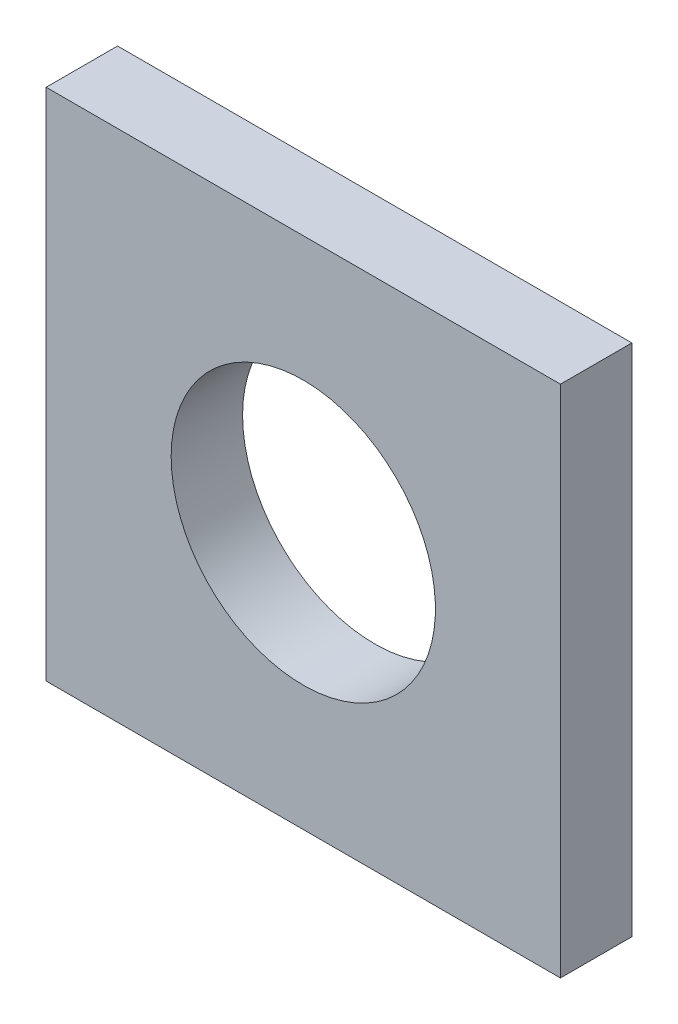
ISO-10303-21;
HEADER;
FILE_DESCRIPTION(('STEP AP214'),'2;1');
FILE_NAME('part.step','',(''),(''),'','','');
FILE_SCHEMA(('AUTOMOTIVE_DESIGN { 1 0 10303 214 1 1 1 1 }'));
ENDSEC;
DATA;
#1=APPLICATION_CONTEXT('core data for automotive mechanical design processes');
#2=APPLICATION_PROTOCOL_DEFINITION('international standard','automotive_design',2000,#1);
#3=PRODUCT_CONTEXT('',#1,'mechanical');
#4=PRODUCT('Part','Part','',(#3));
#5=PRODUCT_RELATED_PRODUCT_CATEGORY('part','',(#4));
#6=PRODUCT_DEFINITION_FORMATION('','',#4);
#7=PRODUCT_DEFINITION_CONTEXT('part definition',#1,'design');
#8=PRODUCT_DEFINITION('design','',#6,#7);
#9=PRODUCT_DEFINITION_SHAPE('','',#8);
#10=(LENGTH_UNIT() NAMED_UNIT(*) SI_UNIT(.MILLI.,.METRE.));
#11=(NAMED_UNIT(*) PLANE_ANGLE_UNIT() SI_UNIT($,.RADIAN.));
#12=(NAMED_UNIT(*) SI_UNIT($,.STERADIAN.) SOLID_ANGLE_UNIT());
#13=UNCERTAINTY_MEASURE_WITH_UNIT(LENGTH_MEASURE(1.E-05),#10,'distance_accuracy_value','');
#14=(GEOMETRIC_REPRESENTATION_CONTEXT(3) GLOBAL_UNCERTAINTY_ASSIGNED_CONTEXT((#13)) GLOBAL_UNIT_ASSIGNED_CONTEXT((#10,
#11,#12)) REPRESENTATION_CONTEXT('',''));
#15=CARTESIAN_POINT('',(0.,0.,0.));
#16=DIRECTION('',(0.,0.,1.));
#17=DIRECTION('',(1.,0.,0.));
#18=AXIS2_PLACEMENT_3D('',#15,#16,#17);
#19=CARTESIAN_POINT('',(0.,0.,0.));
#20=DIRECTION('',(0.,0.,1.));
#21=DIRECTION('',(1.,0.,0.));
#22=AXIS2_PLACEMENT_3D('',#19,#20,#21);
#23=PLANE('',#22);
#24=CARTESIAN_POINT('',(17.8459235605229,-15.7575757575758,0.));
#25=DIRECTION('',(0.,0.,-1.));
#26=DIRECTION('',(-1.,0.,0.));
#27=AXIS2_PLACEMENT_3D('',#24,#25,#26);
#28=CIRCLE('',#27,9.25);
#29=CARTESIAN_POINT('',(8.59592356052291,-15.7575757575758,0.));
#30=VERTEX_POINT('',#29);
#31=EDGE_CURVE('E96',#30,#30,#28,.T.);
#32=ORIENTED_EDGE('',*,*,#31,.F.);
#33=EDGE_LOOP('',(#32));
#34=FACE_BOUND('',#33,.T.);
#35=DIRECTION('',(0.,-1.,0.));
#36=VECTOR('',#35,1.);
#37=CARTESIAN_POINT('',(-0.154076439477094,2.24242424242424,0.));
#38=LINE('',#37,#36);
#39=CARTESIAN_POINT('',(-0.154076439477094,2.24242424242424,0.));
#40=VERTEX_POINT('',#39);
#41=CARTESIAN_POINT('',(-0.15407643947709,-33.7575757575758,0.));
#42=VERTEX_POINT('',#41);
#43=EDGE_CURVE('E79',#40,#42,#38,.T.);
#44=ORIENTED_EDGE('',*,*,#43,.F.);
#45=DIRECTION('',(-1.,0.,0.));
#46=VECTOR('',#45,1.);
#47=CARTESIAN_POINT('',(-0.154076439477094,2.24242424242424,0.));
#48=LINE('',#47,#46);
#49=CARTESIAN_POINT('',(35.8459235605229,2.24242424242424,0.));
#50=VERTEX_POINT('',#49);
#51=EDGE_CURVE('E48',#50,#40,#48,.T.);
#52=ORIENTED_EDGE('',*,*,#51,.F.);
#53=DIRECTION('',(0.,1.,0.));
#54=VECTOR('',#53,1.);
#55=CARTESIAN_POINT('',(35.8459235605229,2.24242424242424,0.));
#56=LINE('',#55,#54);
#57=CARTESIAN_POINT('',(35.8459235605229,-33.7575757575758,0.));
#58=VERTEX_POINT('',#57);
#59=EDGE_CURVE('E56',#58,#50,#56,.T.);
#60=ORIENTED_EDGE('',*,*,#59,.F.);
#61=DIRECTION('',(1.,0.,0.));
#62=VECTOR('',#61,1.);
#63=CARTESIAN_POINT('',(-0.15407643947709,-33.7575757575758,0.));
#64=LINE('',#63,#62);
#65=EDGE_CURVE('E151',#42,#58,#64,.T.);
#66=ORIENTED_EDGE('',*,*,#65,.F.);
#67=EDGE_LOOP('',(#44,#52,#60,#66));
#68=FACE_BOUND('',#67,.T.);
#69=CARTESIAN_POINT('',(2.5959235605229,-0.507575757575758,0.));
#70=DIRECTION('',(0.,0.,1.));
#71=DIRECTION('',(1.,0.,0.));
#72=AXIS2_PLACEMENT_3D('',#69,#70,#71);
#73=CIRCLE('',#72,2.25);
#74=CARTESIAN_POINT('',(4.8459235605229,-0.507575757575758,0.));
#75=VERTEX_POINT('',#74);
#76=EDGE_CURVE('E147',#75,#75,#73,.T.);
#77=ORIENTED_EDGE('',*,*,#76,.T.);
#78=EDGE_LOOP('',(#77));
#79=FACE_BOUND('',#78,.T.);
#80=CARTESIAN_POINT('',(17.8459235605229,-0.507575757575758,0.));
#81=DIRECTION('',(0.,0.,1.));
#82=DIRECTION('',(1.,0.,0.));
#83=AXIS2_PLACEMENT_3D('',#80,#81,#82);
#84=CIRCLE('',#83,2.25);
#85=CARTESIAN_POINT('',(20.0959235605229,-0.507575757575758,0.));
#86=VERTEX_POINT('',#85);
#87=EDGE_CURVE('E144',#86,#86,#84,.T.);
#88=ORIENTED_EDGE('',*,*,#87,.T.);
#89=EDGE_LOOP('',(#88));
#90=FACE_BOUND('',#89,.T.);
#91=CARTESIAN_POINT('',(33.0959235605229,-0.507575757575759,0.));
#92=DIRECTION('',(0.,0.,1.));
#93=DIRECTION('',(1.,0.,0.));
#94=AXIS2_PLACEMENT_3D('',#91,#92,#93);
#95=CIRCLE('',#94,2.25);
#96=CARTESIAN_POINT('',(35.3459235605229,-0.507575757575759,0.));
#97=VERTEX_POINT('',#96);
#98=EDGE_CURVE('E141',#97,#97,#95,.T.);
#99=ORIENTED_EDGE('',*,*,#98,.T.);
#100=EDGE_LOOP('',(#99));
#101=FACE_BOUND('',#100,.T.);
#102=CARTESIAN_POINT('',(33.0959235605229,-15.7575757575758,0.));
#103=DIRECTION('',(0.,0.,1.));
#104=DIRECTION('',(1.,0.,0.));
#105=AXIS2_PLACEMENT_3D('',#102,#103,#104);
#106=CIRCLE('',#105,2.25);
#107=CARTESIAN_POINT('',(35.3459235605229,-15.7575757575758,0.));
#108=VERTEX_POINT('',#107);
#109=EDGE_CURVE('E138',#108,#108,#106,.T.);
#110=ORIENTED_EDGE('',*,*,#109,.T.);
#111=EDGE_LOOP('',(#110));
#112=FACE_BOUND('',#111,.T.);
#113=CARTESIAN_POINT('',(33.0959235605229,-31.0075757575758,0.));
#114=DIRECTION('',(0.,0.,1.));
#115=DIRECTION('',(1.,0.,0.));
#116=AXIS2_PLACEMENT_3D('',#113,#114,#115);
#117=CIRCLE('',#116,2.25);
#118=CARTESIAN_POINT('',(35.3459235605229,-31.0075757575758,0.));
#119=VERTEX_POINT('',#118);
#120=EDGE_CURVE('E135',#119,#119,#117,.T.);
#121=ORIENTED_EDGE('',*,*,#120,.T.);
#122=EDGE_LOOP('',(#121));
#123=FACE_BOUND('',#122,.T.);
#124=CARTESIAN_POINT('',(17.8459235605229,-31.0075757575758,0.));
#125=DIRECTION('',(0.,0.,1.));
#126=DIRECTION('',(1.,0.,0.));
#127=AXIS2_PLACEMENT_3D('',#124,#125,#126);
#128=CIRCLE('',#127,2.25);
#129=CARTESIAN_POINT('',(20.0959235605229,-31.0075757575758,0.));
#130=VERTEX_POINT('',#129);
#131=EDGE_CURVE('E132',#130,#130,#128,.T.);
#132=ORIENTED_EDGE('',*,*,#131,.T.);
#133=EDGE_LOOP('',(#132));
#134=FACE_BOUND('',#133,.T.);
#135=CARTESIAN_POINT('',(2.5959235605229,-31.0075757575758,0.));
#136=DIRECTION('',(0.,0.,1.));
#137=DIRECTION('',(1.,0.,0.));
#138=AXIS2_PLACEMENT_3D('',#135,#136,#137);
#139=CIRCLE('',#138,2.25);
#140=CARTESIAN_POINT('',(4.8459235605229,-31.0075757575758,0.));
#141=VERTEX_POINT('',#140);
#142=EDGE_CURVE('E129',#141,#141,#139,.T.);
#143=ORIENTED_EDGE('',*,*,#142,.T.);
#144=EDGE_LOOP('',(#143));
#145=FACE_BOUND('',#144,.T.);
#146=CARTESIAN_POINT('',(2.59592356052291,-15.7575757575758,0.));
#147=DIRECTION('',(0.,0.,1.));
#148=DIRECTION('',(1.,0.,0.));
#149=AXIS2_PLACEMENT_3D('',#146,#147,#148);
#150=CIRCLE('',#149,2.25);
#151=CARTESIAN_POINT('',(4.84592356052291,-15.7575757575758,0.));
#152=VERTEX_POINT('',#151);
#153=EDGE_CURVE('E126',#152,#152,#150,.T.);
#154=ORIENTED_EDGE('',*,*,#153,.T.);
#155=EDGE_LOOP('',(#154));
#156=FACE_BOUND('',#155,.T.);
#157=ADVANCED_FACE('F33',(#34,#68,#79,#90,#101,#112,#123,#134,#145,#156),#23,.F.);
#158=CARTESIAN_POINT('',(-0.154076439477094,2.24242424242424,3.));
#159=DIRECTION('',(1.,0.,0.));
#160=DIRECTION('',(0.,1.,0.));
#161=AXIS2_PLACEMENT_3D('',#158,#159,#160);
#162=PLANE('',#161);
#163=ORIENTED_EDGE('',*,*,#43,.T.);
#164=DIRECTION('',(0.,0.,-1.));
#165=VECTOR('',#164,1.);
#166=CARTESIAN_POINT('',(-0.15407643947709,-33.7575757575758,3.));
#167=LINE('',#166,#165);
#168=CARTESIAN_POINT('',(-0.154076439477094,-33.7575757575758,5.));
#169=VERTEX_POINT('',#168);
#170=EDGE_CURVE('E11',#169,#42,#167,.T.);
#171=ORIENTED_EDGE('',*,*,#170,.F.);
#172=DIRECTION('',(0.,-1.,0.));
#173=VECTOR('',#172,1.);
#174=CARTESIAN_POINT('',(-0.154076439477094,2.24242424242424,5.));
#175=LINE('',#174,#173);
#176=CARTESIAN_POINT('',(-0.154076439477094,2.24242424242424,5.));
#177=VERTEX_POINT('',#176);
#178=EDGE_CURVE('E77',#177,#169,#175,.T.);
#179=ORIENTED_EDGE('',*,*,#178,.F.);
#180=DIRECTION('',(0.,0.,-1.));
#181=VECTOR('',#180,1.);
#182=CARTESIAN_POINT('',(-0.154076439477094,2.24242424242424,3.));
#183=LINE('',#182,#181);
#184=EDGE_CURVE('E155',#177,#40,#183,.T.);
#185=ORIENTED_EDGE('',*,*,#184,.T.);
#186=EDGE_LOOP('',(#163,#171,#179,#185));
#187=FACE_BOUND('',#186,.T.);
#188=ADVANCED_FACE('F35',(#187),#162,.F.);
#189=CARTESIAN_POINT('',(-0.15407643947709,-33.7575757575758,3.));
#190=DIRECTION('',(0.,1.,0.));
#191=DIRECTION('',(0.,0.,1.));
#192=AXIS2_PLACEMENT_3D('',#189,#190,#191);
#193=PLANE('',#192);
#194=ORIENTED_EDGE('',*,*,#65,.T.);
#195=DIRECTION('',(0.,0.,-1.));
#196=VECTOR('',#195,1.);
#197=CARTESIAN_POINT('',(35.8459235605229,-33.7575757575758,3.));
#198=LINE('',#197,#196);
#199=CARTESIAN_POINT('',(35.8459235605229,-33.7575757575758,5.));
#200=VERTEX_POINT('',#199);
#201=EDGE_CURVE('E41',#200,#58,#198,.T.);
#202=ORIENTED_EDGE('',*,*,#201,.F.);
#203=DIRECTION('',(1.,0.,0.));
#204=VECTOR('',#203,1.);
#205=CARTESIAN_POINT('',(-0.154076439477094,-33.7575757575758,5.));
#206=LINE('',#205,#204);
#207=EDGE_CURVE('E82',#169,#200,#206,.T.);
#208=ORIENTED_EDGE('',*,*,#207,.F.);
#209=ORIENTED_EDGE('',*,*,#170,.T.);
#210=EDGE_LOOP('',(#194,#202,#208,#209));
#211=FACE_BOUND('',#210,.T.);
#212=ADVANCED_FACE('F83',(#211),#193,.F.);
#213=CARTESIAN_POINT('',(35.8459235605229,2.24242424242424,3.));
#214=DIRECTION('',(-1.,0.,0.));
#215=DIRECTION('',(0.,-1.,0.));
#216=AXIS2_PLACEMENT_3D('',#213,#214,#215);
#217=PLANE('',#216);
#218=ORIENTED_EDGE('',*,*,#59,.T.);
#219=DIRECTION('',(0.,0.,-1.));
#220=VECTOR('',#219,1.);
#221=CARTESIAN_POINT('',(35.8459235605229,2.24242424242424,3.));
#222=LINE('',#221,#220);
#223=CARTESIAN_POINT('',(35.8459235605229,2.24242424242424,5.));
#224=VERTEX_POINT('',#223);
#225=EDGE_CURVE('E157',#224,#50,#222,.T.);
#226=ORIENTED_EDGE('',*,*,#225,.F.);
#227=DIRECTION('',(0.,1.,0.));
#228=VECTOR('',#227,1.);
#229=CARTESIAN_POINT('',(35.8459235605229,2.24242424242424,5.));
#230=LINE('',#229,#228);
#231=EDGE_CURVE('E87',#200,#224,#230,.T.);
#232=ORIENTED_EDGE('',*,*,#231,.F.);
#233=ORIENTED_EDGE('',*,*,#201,.T.);
#234=EDGE_LOOP('',(#218,#226,#232,#233));
#235=FACE_BOUND('',#234,.T.);
#236=ADVANCED_FACE('F158',(#235),#217,.F.);
#237=CARTESIAN_POINT('',(-0.154076439477094,2.24242424242424,3.));
#238=DIRECTION('',(0.,-1.,0.));
#239=DIRECTION('',(0.,0.,-1.));
#240=AXIS2_PLACEMENT_3D('',#237,#238,#239);
#241=PLANE('',#240);
#242=ORIENTED_EDGE('',*,*,#51,.T.);
#243=ORIENTED_EDGE('',*,*,#184,.F.);
#244=DIRECTION('',(-1.,0.,0.));
#245=VECTOR('',#244,1.);
#246=CARTESIAN_POINT('',(-0.154076439477094,2.24242424242424,5.));
#247=LINE('',#246,#245);
#248=EDGE_CURVE('E92',#224,#177,#247,.T.);
#249=ORIENTED_EDGE('',*,*,#248,.F.);
#250=ORIENTED_EDGE('',*,*,#225,.T.);
#251=EDGE_LOOP('',(#242,#243,#249,#250));
#252=FACE_BOUND('',#251,.T.);
#253=ADVANCED_FACE('F220',(#252),#241,.F.);
#254=CARTESIAN_POINT('',(2.5959235605229,-0.507575757575758,3.));
#255=DIRECTION('',(0.,0.,-1.));
#256=DIRECTION('',(-1.,0.,0.));
#257=AXIS2_PLACEMENT_3D('',#254,#255,#256);
#258=CYLINDRICAL_SURFACE('',#257,2.25);
#259=CARTESIAN_POINT('',(2.5959235605229,-0.507575757575758,3.));
#260=DIRECTION('',(0.,0.,1.));
#261=DIRECTION('',(1.,0.,0.));
#262=AXIS2_PLACEMENT_3D('',#259,#260,#261);
#263=CIRCLE('',#262,2.25);
#264=CARTESIAN_POINT('',(4.8459235605229,-0.507575757575758,3.));
#265=VERTEX_POINT('',#264);
#266=EDGE_CURVE('E123',#265,#265,#263,.T.);
#267=ORIENTED_EDGE('',*,*,#266,.T.);
#268=EDGE_LOOP('',(#267));
#269=FACE_BOUND('',#268,.T.);
#270=ORIENTED_EDGE('',*,*,#76,.F.);
#271=EDGE_LOOP('',(#270));
#272=FACE_BOUND('',#271,.T.);
#273=ADVANCED_FACE('F217',(#269,#272),#258,.F.);
#274=CARTESIAN_POINT('',(17.8459235605229,-0.507575757575758,3.));
#275=DIRECTION('',(0.,0.,-1.));
#276=DIRECTION('',(-1.,0.,0.));
#277=AXIS2_PLACEMENT_3D('',#274,#275,#276);
#278=CYLINDRICAL_SURFACE('',#277,2.25);
#279=CARTESIAN_POINT('',(17.8459235605229,-0.507575757575758,3.));
#280=DIRECTION('',(0.,0.,1.));
#281=DIRECTION('',(1.,0.,0.));
#282=AXIS2_PLACEMENT_3D('',#279,#280,#281);
#283=CIRCLE('',#282,2.25);
#284=CARTESIAN_POINT('',(20.0959235605229,-0.507575757575758,3.));
#285=VERTEX_POINT('',#284);
#286=EDGE_CURVE('E120',#285,#285,#283,.T.);
#287=ORIENTED_EDGE('',*,*,#286,.T.);
#288=EDGE_LOOP('',(#287));
#289=FACE_BOUND('',#288,.T.);
#290=ORIENTED_EDGE('',*,*,#87,.F.);
#291=EDGE_LOOP('',(#290));
#292=FACE_BOUND('',#291,.T.);
#293=ADVANCED_FACE('F213',(#289,#292),#278,.F.);
#294=CARTESIAN_POINT('',(33.0959235605229,-0.507575757575759,3.));
#295=DIRECTION('',(0.,0.,-1.));
#296=DIRECTION('',(-1.,0.,0.));
#297=AXIS2_PLACEMENT_3D('',#294,#295,#296);
#298=CYLINDRICAL_SURFACE('',#297,2.25);
#299=CARTESIAN_POINT('',(33.0959235605229,-0.507575757575759,3.));
#300=DIRECTION('',(0.,0.,1.));
#301=DIRECTION('',(1.,0.,0.));
#302=AXIS2_PLACEMENT_3D('',#299,#300,#301);
#303=CIRCLE('',#302,2.25);
#304=CARTESIAN_POINT('',(35.3459235605229,-0.507575757575759,3.));
#305=VERTEX_POINT('',#304);
#306=EDGE_CURVE('E117',#305,#305,#303,.T.);
#307=ORIENTED_EDGE('',*,*,#306,.T.);
#308=EDGE_LOOP('',(#307));
#309=FACE_BOUND('',#308,.T.);
#310=ORIENTED_EDGE('',*,*,#98,.F.);
#311=EDGE_LOOP('',(#310));
#312=FACE_BOUND('',#311,.T.);
#313=ADVANCED_FACE('F209',(#309,#312),#298,.F.);
#314=CARTESIAN_POINT('',(33.0959235605229,-15.7575757575758,3.));
#315=DIRECTION('',(0.,0.,-1.));
#316=DIRECTION('',(-1.,0.,0.));
#317=AXIS2_PLACEMENT_3D('',#314,#315,#316);
#318=CYLINDRICAL_SURFACE('',#317,2.25);
#319=CARTESIAN_POINT('',(33.0959235605229,-15.7575757575758,3.));
#320=DIRECTION('',(0.,0.,1.));
#321=DIRECTION('',(1.,0.,0.));
#322=AXIS2_PLACEMENT_3D('',#319,#320,#321);
#323=CIRCLE('',#322,2.25);
#324=CARTESIAN_POINT('',(35.3459235605229,-15.7575757575758,3.));
#325=VERTEX_POINT('',#324);
#326=EDGE_CURVE('E114',#325,#325,#323,.T.);
#327=ORIENTED_EDGE('',*,*,#326,.T.);
#328=EDGE_LOOP('',(#327));
#329=FACE_BOUND('',#328,.T.);
#330=ORIENTED_EDGE('',*,*,#109,.F.);
#331=EDGE_LOOP('',(#330));
#332=FACE_BOUND('',#331,.T.);
#333=ADVANCED_FACE('F205',(#329,#332),#318,.F.);
#334=CARTESIAN_POINT('',(33.0959235605229,-31.0075757575758,3.));
#335=DIRECTION('',(0.,0.,-1.));
#336=DIRECTION('',(-1.,0.,0.));
#337=AXIS2_PLACEMENT_3D('',#334,#335,#336);
#338=CYLINDRICAL_SURFACE('',#337,2.25);
#339=CARTESIAN_POINT('',(33.0959235605229,-31.0075757575758,3.));
#340=DIRECTION('',(0.,0.,1.));
#341=DIRECTION('',(1.,0.,0.));
#342=AXIS2_PLACEMENT_3D('',#339,#340,#341);
#343=CIRCLE('',#342,2.25);
#344=CARTESIAN_POINT('',(35.3459235605229,-31.0075757575758,3.));
#345=VERTEX_POINT('',#344);
#346=EDGE_CURVE('E111',#345,#345,#343,.T.);
#347=ORIENTED_EDGE('',*,*,#346,.T.);
#348=EDGE_LOOP('',(#347));
#349=FACE_BOUND('',#348,.T.);
#350=ORIENTED_EDGE('',*,*,#120,.F.);
#351=EDGE_LOOP('',(#350));
#352=FACE_BOUND('',#351,.T.);
#353=ADVANCED_FACE('F201',(#349,#352),#338,.F.);
#354=CARTESIAN_POINT('',(17.8459235605229,-31.0075757575758,3.));
#355=DIRECTION('',(0.,0.,-1.));
#356=DIRECTION('',(-1.,0.,0.));
#357=AXIS2_PLACEMENT_3D('',#354,#355,#356);
#358=CYLINDRICAL_SURFACE('',#357,2.25);
#359=CARTESIAN_POINT('',(17.8459235605229,-31.0075757575758,3.));
#360=DIRECTION('',(0.,0.,1.));
#361=DIRECTION('',(1.,0.,0.));
#362=AXIS2_PLACEMENT_3D('',#359,#360,#361);
#363=CIRCLE('',#362,2.25);
#364=CARTESIAN_POINT('',(20.0959235605229,-31.0075757575758,3.));
#365=VERTEX_POINT('',#364);
#366=EDGE_CURVE('E108',#365,#365,#363,.T.);
#367=ORIENTED_EDGE('',*,*,#366,.T.);
#368=EDGE_LOOP('',(#367));
#369=FACE_BOUND('',#368,.T.);
#370=ORIENTED_EDGE('',*,*,#131,.F.);
#371=EDGE_LOOP('',(#370));
#372=FACE_BOUND('',#371,.T.);
#373=ADVANCED_FACE('F194',(#369,#372),#358,.F.);
#374=CARTESIAN_POINT('',(2.5959235605229,-31.0075757575758,3.));
#375=DIRECTION('',(0.,0.,-1.));
#376=DIRECTION('',(-1.,0.,0.));
#377=AXIS2_PLACEMENT_3D('',#374,#375,#376);
#378=CYLINDRICAL_SURFACE('',#377,2.25);
#379=CARTESIAN_POINT('',(2.5959235605229,-31.0075757575758,3.));
#380=DIRECTION('',(0.,0.,1.));
#381=DIRECTION('',(1.,0.,0.));
#382=AXIS2_PLACEMENT_3D('',#379,#380,#381);
#383=CIRCLE('',#382,2.25);
#384=CARTESIAN_POINT('',(4.8459235605229,-31.0075757575758,3.));
#385=VERTEX_POINT('',#384);
#386=EDGE_CURVE('E105',#385,#385,#383,.T.);
#387=ORIENTED_EDGE('',*,*,#386,.T.);
#388=EDGE_LOOP('',(#387));
#389=FACE_BOUND('',#388,.T.);
#390=ORIENTED_EDGE('',*,*,#142,.F.);
#391=EDGE_LOOP('',(#390));
#392=FACE_BOUND('',#391,.T.);
#393=ADVANCED_FACE('F183',(#389,#392),#378,.F.);
#394=CARTESIAN_POINT('',(2.59592356052291,-15.7575757575758,3.));
#395=DIRECTION('',(0.,0.,-1.));
#396=DIRECTION('',(-1.,0.,0.));
#397=AXIS2_PLACEMENT_3D('',#394,#395,#396);
#398=CYLINDRICAL_SURFACE('',#397,2.25);
#399=CARTESIAN_POINT('',(2.59592356052291,-15.7575757575758,3.));
#400=DIRECTION('',(0.,0.,1.));
#401=DIRECTION('',(1.,0.,0.));
#402=AXIS2_PLACEMENT_3D('',#399,#400,#401);
#403=CIRCLE('',#402,2.25);
#404=CARTESIAN_POINT('',(4.84592356052291,-15.7575757575758,3.));
#405=VERTEX_POINT('',#404);
#406=EDGE_CURVE('E102',#405,#405,#403,.T.);
#407=ORIENTED_EDGE('',*,*,#406,.T.);
#408=EDGE_LOOP('',(#407));
#409=FACE_BOUND('',#408,.T.);
#410=ORIENTED_EDGE('',*,*,#153,.F.);
#411=EDGE_LOOP('',(#410));
#412=FACE_BOUND('',#411,.T.);
#413=ADVANCED_FACE('F180',(#409,#412),#398,.F.);
#414=CARTESIAN_POINT('',(0.,0.,3.));
#415=DIRECTION('',(0.,0.,1.));
#416=DIRECTION('',(1.,0.,0.));
#417=AXIS2_PLACEMENT_3D('',#414,#415,#416);
#418=PLANE('',#417);
#419=ORIENTED_EDGE('',*,*,#406,.F.);
#420=EDGE_LOOP('',(#419));
#421=FACE_BOUND('',#420,.T.);
#422=ADVANCED_FACE('F182',(#421),#418,.F.);
#423=ORIENTED_EDGE('',*,*,#386,.F.);
#424=EDGE_LOOP('',(#423));
#425=FACE_BOUND('',#424,.T.);
#426=ADVANCED_FACE('F190',(#425),#418,.F.);
#427=ORIENTED_EDGE('',*,*,#366,.F.);
#428=EDGE_LOOP('',(#427));
#429=FACE_BOUND('',#428,.T.);
#430=ADVANCED_FACE('F295',(#429),#418,.F.);
#431=ORIENTED_EDGE('',*,*,#346,.F.);
#432=EDGE_LOOP('',(#431));
#433=FACE_BOUND('',#432,.T.);
#434=ADVANCED_FACE('F288',(#433),#418,.F.);
#435=ORIENTED_EDGE('',*,*,#326,.F.);
#436=EDGE_LOOP('',(#435));
#437=FACE_BOUND('',#436,.T.);
#438=ADVANCED_FACE('F281',(#437),#418,.F.);
#439=ORIENTED_EDGE('',*,*,#306,.F.);
#440=EDGE_LOOP('',(#439));
#441=FACE_BOUND('',#440,.T.);
#442=ADVANCED_FACE('F274',(#441),#418,.F.);
#443=ORIENTED_EDGE('',*,*,#286,.F.);
#444=EDGE_LOOP('',(#443));
#445=FACE_BOUND('',#444,.T.);
#446=ADVANCED_FACE('F270',(#445),#418,.F.);
#447=ORIENTED_EDGE('',*,*,#266,.F.);
#448=EDGE_LOOP('',(#447));
#449=FACE_BOUND('',#448,.T.);
#450=ADVANCED_FACE('F193',(#449),#418,.F.);
#451=CARTESIAN_POINT('',(0.,0.,5.));
#452=DIRECTION('',(0.,0.,1.));
#453=DIRECTION('',(1.,0.,0.));
#454=AXIS2_PLACEMENT_3D('',#451,#452,#453);
#455=PLANE('',#454);
#456=CARTESIAN_POINT('',(17.8459235605229,-15.7575757575758,5.));
#457=DIRECTION('',(0.,0.,-1.));
#458=DIRECTION('',(-1.,0.,0.));
#459=AXIS2_PLACEMENT_3D('',#456,#457,#458);
#460=CIRCLE('',#459,9.25);
#461=CARTESIAN_POINT('',(8.59592356052291,-15.7575757575758,5.));
#462=VERTEX_POINT('',#461);
#463=EDGE_CURVE('E93',#462,#462,#460,.T.);
#464=ORIENTED_EDGE('',*,*,#463,.T.);
#465=EDGE_LOOP('',(#464));
#466=FACE_BOUND('',#465,.T.);
#467=ORIENTED_EDGE('',*,*,#178,.T.);
#468=ORIENTED_EDGE('',*,*,#207,.T.);
#469=ORIENTED_EDGE('',*,*,#231,.T.);
#470=ORIENTED_EDGE('',*,*,#248,.T.);
#471=EDGE_LOOP('',(#467,#468,#469,#470));
#472=FACE_BOUND('',#471,.T.);
#473=ADVANCED_FACE('F90',(#466,#472),#455,.T.);
#474=CARTESIAN_POINT('',(17.8459235605229,-15.7575757575758,5.));
#475=DIRECTION('',(0.,0.,-1.));
#476=DIRECTION('',(-1.,0.,0.));
#477=AXIS2_PLACEMENT_3D('',#474,#475,#476);
#478=CYLINDRICAL_SURFACE('',#477,9.25);
#479=ORIENTED_EDGE('',*,*,#463,.F.);
#480=EDGE_LOOP('',(#479));
#481=FACE_BOUND('',#480,.T.);
#482=ORIENTED_EDGE('',*,*,#31,.T.);
#483=EDGE_LOOP('',(#482));
#484=FACE_BOUND('',#483,.T.);
#485=ADVANCED_FACE('F251',(#481,#484),#478,.F.);
#486=CLOSED_SHELL('',(#157,#188,#212,#236,#253,#273,#293,#313,#333,#353,#373,#393,#413,#422,
#426,#430,#434,#438,#442,#446,#450,#473,#485));
#487=MANIFOLD_SOLID_BREP('B2',#486);
#488=ADVANCED_BREP_SHAPE_REPRESENTATION('',(#18,#487),#14);
#489=SHAPE_DEFINITION_REPRESENTATION(#9,#488);
ENDSEC;
END-ISO-10303-21;
